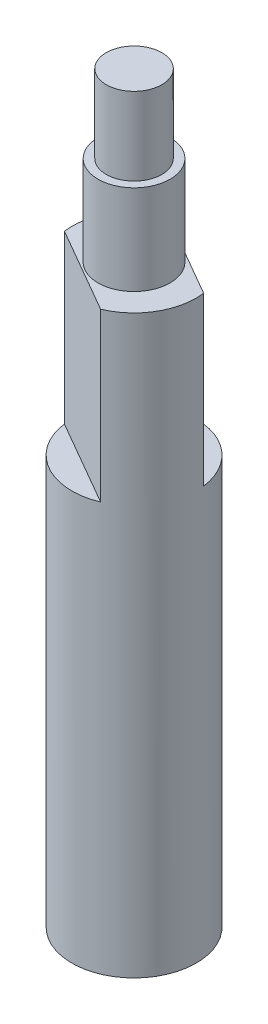
ISO-10303-21;
HEADER;
FILE_DESCRIPTION(('STEP AP214'),'2;1');
FILE_NAME('part.step','',(''),(''),'','','');
FILE_SCHEMA(('AUTOMOTIVE_DESIGN { 1 0 10303 214 1 1 1 1 }'));
ENDSEC;
DATA;
#1=APPLICATION_CONTEXT('core data for automotive mechanical design processes');
#2=APPLICATION_PROTOCOL_DEFINITION('international standard','automotive_design',2000,#1);
#3=PRODUCT_CONTEXT('',#1,'mechanical');
#4=PRODUCT('Part','Part','',(#3));
#5=PRODUCT_RELATED_PRODUCT_CATEGORY('part','',(#4));
#6=PRODUCT_DEFINITION_FORMATION('','',#4);
#7=PRODUCT_DEFINITION_CONTEXT('part definition',#1,'design');
#8=PRODUCT_DEFINITION('design','',#6,#7);
#9=PRODUCT_DEFINITION_SHAPE('','',#8);
#10=(LENGTH_UNIT() NAMED_UNIT(*) SI_UNIT(.MILLI.,.METRE.));
#11=(NAMED_UNIT(*) PLANE_ANGLE_UNIT() SI_UNIT($,.RADIAN.));
#12=(NAMED_UNIT(*) SI_UNIT($,.STERADIAN.) SOLID_ANGLE_UNIT());
#13=UNCERTAINTY_MEASURE_WITH_UNIT(LENGTH_MEASURE(1.E-05),#10,'distance_accuracy_value','');
#14=(GEOMETRIC_REPRESENTATION_CONTEXT(3) GLOBAL_UNCERTAINTY_ASSIGNED_CONTEXT((#13)) GLOBAL_UNIT_ASSIGNED_CONTEXT((#10,
#11,#12)) REPRESENTATION_CONTEXT('',''));
#15=CARTESIAN_POINT('',(0.,0.,0.));
#16=DIRECTION('',(0.,0.,1.));
#17=DIRECTION('',(1.,0.,0.));
#18=AXIS2_PLACEMENT_3D('',#15,#16,#17);
#19=CARTESIAN_POINT('',(625.914623134768,156.070044002464,0.));
#20=DIRECTION('',(0.,1.,0.));
#21=DIRECTION('',(0.,0.,1.));
#22=AXIS2_PLACEMENT_3D('',#19,#20,#21);
#23=PLANE('',#22);
#24=CARTESIAN_POINT('',(625.914623134768,156.070044002464,0.));
#25=DIRECTION('',(0.,1.,0.));
#26=DIRECTION('',(0.,0.,1.));
#27=AXIS2_PLACEMENT_3D('',#24,#25,#26);
#28=CIRCLE('',#27,3.175);
#29=CARTESIAN_POINT('',(625.914623134768,156.070044002464,3.17500000000001));
#30=VERTEX_POINT('',#29);
#31=EDGE_CURVE('E145',#30,#30,#28,.T.);
#32=ORIENTED_EDGE('',*,*,#31,.T.);
#33=EDGE_LOOP('',(#32));
#34=FACE_BOUND('',#33,.T.);
#35=CARTESIAN_POINT('',(625.914623134768,156.070044002464,0.));
#36=DIRECTION('',(0.,1.,0.));
#37=DIRECTION('',(0.,0.,1.));
#38=AXIS2_PLACEMENT_3D('',#35,#36,#37);
#39=CIRCLE('',#38,2.4511);
#40=CARTESIAN_POINT('',(625.914623134768,156.070044002464,-2.4511));
#41=VERTEX_POINT('',#40);
#42=EDGE_CURVE('E152',#41,#41,#39,.T.);
#43=ORIENTED_EDGE('',*,*,#42,.F.);
#44=EDGE_LOOP('',(#43));
#45=FACE_BOUND('',#44,.T.);
#46=ADVANCED_FACE('F32',(#34,#45),#23,.T.);
#47=CARTESIAN_POINT('',(631.401023134768,148.145244002464,0.));
#48=DIRECTION('',(0.,1.,0.));
#49=DIRECTION('',(0.,0.,1.));
#50=AXIS2_PLACEMENT_3D('',#47,#48,#49);
#51=PLANE('',#50);
#52=DIRECTION('',(0.866025403784436,0.,0.500000000000005));
#53=VECTOR('',#52,1.);
#54=CARTESIAN_POINT('',(623.800526733425,148.145244002464,-5.06272469781131));
#55=LINE('',#54,#53);
#56=CARTESIAN_POINT('',(623.800526733425,148.145244002464,-5.06272469781133));
#57=VERTEX_POINT('',#56);
#58=CARTESIAN_POINT('',(631.356119536111,148.145244002464,-0.700501159293341));
#59=VERTEX_POINT('',#58);
#60=EDGE_CURVE('E78',#57,#59,#55,.T.);
#61=ORIENTED_EDGE('',*,*,#60,.F.);
#62=CARTESIAN_POINT('',(625.914623134768,148.145244002464,0.));
#63=DIRECTION('',(0.,-1.,0.));
#64=DIRECTION('',(0.,0.,-1.));
#65=AXIS2_PLACEMENT_3D('',#62,#63,#64);
#66=CIRCLE('',#65,5.4864);
#67=CARTESIAN_POINT('',(620.473126733425,148.145244002464,0.700501159293356));
#68=VERTEX_POINT('',#67);
#69=EDGE_CURVE('E11',#68,#57,#66,.T.);
#70=ORIENTED_EDGE('',*,*,#69,.F.);
#71=DIRECTION('',(-0.866025403784436,0.,-0.500000000000005));
#72=VECTOR('',#71,1.);
#73=CARTESIAN_POINT('',(628.028719536111,148.145244002464,5.06272469781132));
#74=LINE('',#73,#72);
#75=CARTESIAN_POINT('',(628.028719536111,148.145244002464,5.06272469781133));
#76=VERTEX_POINT('',#75);
#77=EDGE_CURVE('E87',#76,#68,#74,.T.);
#78=ORIENTED_EDGE('',*,*,#77,.F.);
#79=EDGE_CURVE('E40',#59,#76,#66,.T.);
#80=ORIENTED_EDGE('',*,*,#79,.F.);
#81=EDGE_LOOP('',(#61,#70,#78,#80));
#82=FACE_BOUND('',#81,.T.);
#83=CARTESIAN_POINT('',(625.914623134768,148.145244002464,0.));
#84=DIRECTION('',(0.,1.,0.));
#85=DIRECTION('',(0.,0.,1.));
#86=AXIS2_PLACEMENT_3D('',#83,#84,#85);
#87=CIRCLE('',#86,3.175);
#88=CARTESIAN_POINT('',(625.914623134768,148.145244002464,3.17500000000001));
#89=VERTEX_POINT('',#88);
#90=EDGE_CURVE('E146',#89,#89,#87,.T.);
#91=ORIENTED_EDGE('',*,*,#90,.F.);
#92=EDGE_LOOP('',(#91));
#93=FACE_BOUND('',#92,.T.);
#94=ADVANCED_FACE('F106',(#82,#93),#51,.T.);
#95=CARTESIAN_POINT('',(625.914623134768,148.145244002464,0.));
#96=DIRECTION('',(0.,-1.,0.));
#97=DIRECTION('',(0.,0.,-1.));
#98=AXIS2_PLACEMENT_3D('',#95,#96,#97);
#99=CYLINDRICAL_SURFACE('',#98,5.4864);
#100=DIRECTION('',(0.,1.,0.));
#101=VECTOR('',#100,1.);
#102=CARTESIAN_POINT('',(623.800526733425,133.413244002464,-5.06272469781131));
#103=LINE('',#102,#101);
#104=CARTESIAN_POINT('',(623.800526733425,133.413244002464,-5.06272469781131));
#105=VERTEX_POINT('',#104);
#106=EDGE_CURVE('E47',#105,#57,#103,.T.);
#107=ORIENTED_EDGE('',*,*,#106,.F.);
#108=CARTESIAN_POINT('',(625.914623134768,133.413244002464,0.));
#109=DIRECTION('',(0.,1.,0.));
#110=DIRECTION('',(0.,0.,1.));
#111=AXIS2_PLACEMENT_3D('',#108,#109,#110);
#112=CIRCLE('',#111,5.48639999999998);
#113=CARTESIAN_POINT('',(631.356119536111,133.413244002464,-0.70050115929334));
#114=VERTEX_POINT('',#113);
#115=EDGE_CURVE('E75',#114,#105,#112,.T.);
#116=ORIENTED_EDGE('',*,*,#115,.F.);
#117=DIRECTION('',(0.,1.,0.));
#118=VECTOR('',#117,1.);
#119=CARTESIAN_POINT('',(631.356119536111,133.413244002464,-0.70050115929334));
#120=LINE('',#119,#118);
#121=EDGE_CURVE('E81',#114,#59,#120,.T.);
#122=ORIENTED_EDGE('',*,*,#121,.T.);
#123=ORIENTED_EDGE('',*,*,#79,.T.);
#124=DIRECTION('',(0.,1.,0.));
#125=VECTOR('',#124,1.);
#126=CARTESIAN_POINT('',(628.028719536111,133.413244002464,5.06272469781132));
#127=LINE('',#126,#125);
#128=CARTESIAN_POINT('',(628.028719536111,133.413244002464,5.06272469781132));
#129=VERTEX_POINT('',#128);
#130=EDGE_CURVE('E96',#129,#76,#127,.T.);
#131=ORIENTED_EDGE('',*,*,#130,.F.);
#132=CARTESIAN_POINT('',(625.914623134768,133.413244002464,0.));
#133=DIRECTION('',(0.,1.,0.));
#134=DIRECTION('',(0.,0.,1.));
#135=AXIS2_PLACEMENT_3D('',#132,#133,#134);
#136=CIRCLE('',#135,5.48639999999998);
#137=CARTESIAN_POINT('',(620.473126733425,133.413244002464,0.700501159293357));
#138=VERTEX_POINT('',#137);
#139=EDGE_CURVE('E91',#138,#129,#136,.T.);
#140=ORIENTED_EDGE('',*,*,#139,.F.);
#141=DIRECTION('',(0.,1.,0.));
#142=VECTOR('',#141,1.);
#143=CARTESIAN_POINT('',(620.473126733425,133.413244002464,0.700501159293357));
#144=LINE('',#143,#142);
#145=EDGE_CURVE('E98',#138,#68,#144,.T.);
#146=ORIENTED_EDGE('',*,*,#145,.T.);
#147=ORIENTED_EDGE('',*,*,#69,.T.);
#148=EDGE_LOOP('',(#107,#116,#122,#123,#131,#140,#146,#147));
#149=FACE_BOUND('',#148,.T.);
#150=CARTESIAN_POINT('',(625.914623134768,97.3452440024636,0.));
#151=DIRECTION('',(0.,-1.,0.));
#152=DIRECTION('',(0.,0.,-1.));
#153=AXIS2_PLACEMENT_3D('',#150,#151,#152);
#154=CIRCLE('',#153,5.4864);
#155=CARTESIAN_POINT('',(625.914623134768,97.3452440024636,-5.4864));
#156=VERTEX_POINT('',#155);
#157=EDGE_CURVE('E100',#156,#156,#154,.T.);
#158=ORIENTED_EDGE('',*,*,#157,.F.);
#159=EDGE_LOOP('',(#158));
#160=FACE_BOUND('',#159,.T.);
#161=ADVANCED_FACE('F34',(#149,#160),#99,.T.);
#162=CARTESIAN_POINT('',(625.914623134768,97.3452440024636,0.));
#163=DIRECTION('',(0.,-1.,0.));
#164=DIRECTION('',(0.,0.,-1.));
#165=AXIS2_PLACEMENT_3D('',#162,#163,#164);
#166=PLANE('',#165);
#167=ORIENTED_EDGE('',*,*,#157,.T.);
#168=EDGE_LOOP('',(#167));
#169=FACE_BOUND('',#168,.T.);
#170=ADVANCED_FACE('F104',(#169),#166,.T.);
#171=CARTESIAN_POINT('',(628.028719536111,133.413244002464,5.06272469781132));
#172=DIRECTION('',(0.500000000000005,0.,-0.866025403784436));
#173=DIRECTION('',(-0.866025403784436,0.,-0.500000000000005));
#174=AXIS2_PLACEMENT_3D('',#171,#172,#173);
#175=PLANE('',#174);
#176=ORIENTED_EDGE('',*,*,#77,.T.);
#177=ORIENTED_EDGE('',*,*,#145,.F.);
#178=DIRECTION('',(-0.866025403784436,0.,-0.500000000000005));
#179=VECTOR('',#178,1.);
#180=CARTESIAN_POINT('',(628.028719536111,133.413244002464,5.06272469781132));
#181=LINE('',#180,#179);
#182=EDGE_CURVE('E93',#129,#138,#181,.T.);
#183=ORIENTED_EDGE('',*,*,#182,.F.);
#184=ORIENTED_EDGE('',*,*,#130,.T.);
#185=EDGE_LOOP('',(#176,#177,#183,#184));
#186=FACE_BOUND('',#185,.T.);
#187=ADVANCED_FACE('F111',(#186),#175,.F.);
#188=CARTESIAN_POINT('',(625.914623134768,133.413244002464,0.));
#189=DIRECTION('',(0.,1.,0.));
#190=DIRECTION('',(0.,0.,1.));
#191=AXIS2_PLACEMENT_3D('',#188,#189,#190);
#192=PLANE('',#191);
#193=ORIENTED_EDGE('',*,*,#139,.T.);
#194=ORIENTED_EDGE('',*,*,#182,.T.);
#195=EDGE_LOOP('',(#193,#194));
#196=FACE_BOUND('',#195,.T.);
#197=ADVANCED_FACE('F133',(#196),#192,.T.);
#198=CARTESIAN_POINT('',(623.800526733425,133.413244002464,-5.06272469781131));
#199=DIRECTION('',(-0.500000000000005,0.,0.866025403784436));
#200=DIRECTION('',(0.866025403784436,0.,0.500000000000005));
#201=AXIS2_PLACEMENT_3D('',#198,#199,#200);
#202=PLANE('',#201);
#203=ORIENTED_EDGE('',*,*,#60,.T.);
#204=ORIENTED_EDGE('',*,*,#121,.F.);
#205=DIRECTION('',(0.866025403784436,0.,0.500000000000005));
#206=VECTOR('',#205,1.);
#207=CARTESIAN_POINT('',(623.800526733425,133.413244002464,-5.06272469781131));
#208=LINE('',#207,#206);
#209=EDGE_CURVE('E77',#105,#114,#208,.T.);
#210=ORIENTED_EDGE('',*,*,#209,.F.);
#211=ORIENTED_EDGE('',*,*,#106,.T.);
#212=EDGE_LOOP('',(#203,#204,#210,#211));
#213=FACE_BOUND('',#212,.T.);
#214=ADVANCED_FACE('F80',(#213),#202,.F.);
#215=CARTESIAN_POINT('',(625.914623134768,133.413244002464,0.));
#216=DIRECTION('',(0.,1.,0.));
#217=DIRECTION('',(0.,0.,1.));
#218=AXIS2_PLACEMENT_3D('',#215,#216,#217);
#219=PLANE('',#218);
#220=ORIENTED_EDGE('',*,*,#115,.T.);
#221=ORIENTED_EDGE('',*,*,#209,.T.);
#222=EDGE_LOOP('',(#220,#221));
#223=FACE_BOUND('',#222,.T.);
#224=ADVANCED_FACE('F76',(#223),#219,.T.);
#225=CARTESIAN_POINT('',(625.914623134768,156.070044002464,0.));
#226=DIRECTION('',(0.,-1.,0.));
#227=DIRECTION('',(0.,0.,-1.));
#228=AXIS2_PLACEMENT_3D('',#225,#226,#227);
#229=CYLINDRICAL_SURFACE('',#228,3.175);
#230=ORIENTED_EDGE('',*,*,#31,.F.);
#231=EDGE_LOOP('',(#230));
#232=FACE_BOUND('',#231,.T.);
#233=ORIENTED_EDGE('',*,*,#90,.T.);
#234=EDGE_LOOP('',(#233));
#235=FACE_BOUND('',#234,.T.);
#236=ADVANCED_FACE('F125',(#232,#235),#229,.T.);
#237=CARTESIAN_POINT('',(625.914623134768,162.928044002464,0.));
#238=DIRECTION('',(0.,-1.,0.));
#239=DIRECTION('',(0.,0.,-1.));
#240=AXIS2_PLACEMENT_3D('',#237,#238,#239);
#241=CYLINDRICAL_SURFACE('',#240,2.4511);
#242=CARTESIAN_POINT('',(625.914623134768,162.928044002464,0.));
#243=DIRECTION('',(0.,1.,0.));
#244=DIRECTION('',(0.,0.,1.));
#245=AXIS2_PLACEMENT_3D('',#242,#243,#244);
#246=CIRCLE('',#245,2.4511);
#247=CARTESIAN_POINT('',(625.914623134768,162.928044002464,-2.4511));
#248=VERTEX_POINT('',#247);
#249=EDGE_CURVE('E150',#248,#248,#246,.T.);
#250=CARTESIAN_POINT('',(625.914623134768,162.928044002464,-2.4511));
#251=CARTESIAN_POINT('',(625.914623134768,162.856606502464,-2.4511));
#252=CARTESIAN_POINT('',(625.914623134768,162.785169002464,-2.4511));
#253=CARTESIAN_POINT('',(625.914623134768,162.642294002464,-2.4511));
#254=CARTESIAN_POINT('',(625.914623134768,162.570856502463,-2.4511));
#255=CARTESIAN_POINT('',(625.914623134768,162.427981502464,-2.4511));
#256=CARTESIAN_POINT('',(625.914623134768,162.356544002463,-2.4511));
#257=CARTESIAN_POINT('',(625.914623134768,162.213669002464,-2.4511));
#258=CARTESIAN_POINT('',(625.914623134768,162.142231502464,-2.4511));
#259=CARTESIAN_POINT('',(625.914623134768,161.999356502464,-2.4511));
#260=CARTESIAN_POINT('',(625.914623134768,161.927919002464,-2.4511));
#261=CARTESIAN_POINT('',(625.914623134768,161.785044002464,-2.4511));
#262=CARTESIAN_POINT('',(625.914623134768,161.713606502464,-2.4511));
#263=CARTESIAN_POINT('',(625.914623134768,161.570731502464,-2.4511));
#264=CARTESIAN_POINT('',(625.914623134768,161.499294002464,-2.4511));
#265=CARTESIAN_POINT('',(625.914623134768,161.356419002464,-2.4511));
#266=CARTESIAN_POINT('',(625.914623134768,161.284981502463,-2.4511));
#267=CARTESIAN_POINT('',(625.914623134768,161.142106502464,-2.4511));
#268=CARTESIAN_POINT('',(625.914623134768,161.070669002463,-2.4511));
#269=CARTESIAN_POINT('',(625.914623134768,160.927794002464,-2.4511));
#270=CARTESIAN_POINT('',(625.914623134768,160.856356502464,-2.4511));
#271=CARTESIAN_POINT('',(625.914623134768,160.713481502464,-2.4511));
#272=CARTESIAN_POINT('',(625.914623134768,160.642044002464,-2.4511));
#273=CARTESIAN_POINT('',(625.914623134768,160.499169002464,-2.4511));
#274=CARTESIAN_POINT('',(625.914623134768,160.427731502464,-2.4511));
#275=CARTESIAN_POINT('',(625.914623134768,160.284856502464,-2.4511));
#276=CARTESIAN_POINT('',(625.914623134768,160.213419002464,-2.4511));
#277=CARTESIAN_POINT('',(625.914623134768,160.070544002464,-2.4511));
#278=CARTESIAN_POINT('',(625.914623134768,159.999106502464,-2.4511));
#279=CARTESIAN_POINT('',(625.914623134768,159.856231502464,-2.4511));
#280=CARTESIAN_POINT('',(625.914623134768,159.784794002464,-2.4511));
#281=CARTESIAN_POINT('',(625.914623134768,159.641919002464,-2.4511));
#282=CARTESIAN_POINT('',(625.914623134768,159.570481502464,-2.4511));
#283=CARTESIAN_POINT('',(625.914623134768,159.427606502464,-2.4511));
#284=CARTESIAN_POINT('',(625.914623134768,159.356169002464,-2.4511));
#285=CARTESIAN_POINT('',(625.914623134768,159.213294002464,-2.4511));
#286=CARTESIAN_POINT('',(625.914623134768,159.141856502464,-2.4511));
#287=CARTESIAN_POINT('',(625.914623134768,158.998981502464,-2.4511));
#288=CARTESIAN_POINT('',(625.914623134768,158.927544002463,-2.4511));
#289=CARTESIAN_POINT('',(625.914623134768,158.784669002464,-2.4511));
#290=CARTESIAN_POINT('',(625.914623134768,158.713231502464,-2.4511));
#291=CARTESIAN_POINT('',(625.914623134768,158.570356502464,-2.4511));
#292=CARTESIAN_POINT('',(625.914623134768,158.498919002464,-2.4511));
#293=CARTESIAN_POINT('',(625.914623134768,158.356044002464,-2.4511));
#294=CARTESIAN_POINT('',(625.914623134768,158.284606502464,-2.4511));
#295=CARTESIAN_POINT('',(625.914623134768,158.141731502464,-2.4511));
#296=CARTESIAN_POINT('',(625.914623134768,158.070294002464,-2.4511));
#297=CARTESIAN_POINT('',(625.914623134768,157.927419002464,-2.4511));
#298=CARTESIAN_POINT('',(625.914623134768,157.855981502464,-2.4511));
#299=CARTESIAN_POINT('',(625.914623134768,157.713106502464,-2.4511));
#300=CARTESIAN_POINT('',(625.914623134768,157.641669002464,-2.4511));
#301=CARTESIAN_POINT('',(625.914623134768,157.498794002464,-2.4511));
#302=CARTESIAN_POINT('',(625.914623134768,157.427356502464,-2.4511));
#303=CARTESIAN_POINT('',(625.914623134768,157.284481502464,-2.4511));
#304=CARTESIAN_POINT('',(625.914623134768,157.213044002464,-2.4511));
#305=CARTESIAN_POINT('',(625.914623134768,157.070169002464,-2.4511));
#306=CARTESIAN_POINT('',(625.914623134768,156.998731502464,-2.4511));
#307=CARTESIAN_POINT('',(625.914623134768,156.855856502464,-2.4511));
#308=CARTESIAN_POINT('',(625.914623134768,156.784419002464,-2.4511));
#309=CARTESIAN_POINT('',(625.914623134768,156.641544002464,-2.4511));
#310=CARTESIAN_POINT('',(625.914623134768,156.570106502464,-2.4511));
#311=CARTESIAN_POINT('',(625.914623134768,156.427231502464,-2.4511));
#312=CARTESIAN_POINT('',(625.914623134768,156.355794002464,-2.4511));
#313=CARTESIAN_POINT('',(625.914623134768,156.212919002464,-2.4511));
#314=CARTESIAN_POINT('',(625.914623134768,156.141481502464,-2.4511));
#315=CARTESIAN_POINT('',(625.914623134768,156.070044002464,-2.4511));
#316=B_SPLINE_CURVE_WITH_KNOTS('',3,(#250,#251,#252,#253,#254,#255,#256,#257,#258,#259,#260,
#261,#262,#263,#264,#265,#266,#267,#268,#269,#270,#271,#272,#273,#274,#275,#276,#277,#278,#279,
#280,#281,#282,#283,#284,#285,#286,#287,#288,#289,#290,#291,#292,#293,#294,#295,#296,#297,#298,
#299,#300,#301,#302,#303,#304,#305,#306,#307,#308,#309,#310,#311,#312,#313,#314,#315),
.UNSPECIFIED.,.F.,.F.,(4,2,2,2,2,2,2,2,2,2,2,2,2,2,2,2,2,2,2,2,2,2,2,2,2,2,2,2,2,2,2,2,4),(0.,
0.21431249999998,0.428624999999988,0.642937499999996,0.857249999999976,1.07156249999998,
1.28587499999999,1.50018749999997,1.71449999999998,1.92881249999999,2.14312499999997,
2.35743749999998,2.57174999999998,2.78606249999996,3.00037499999997,3.21468749999998,
3.42899999999999,3.64331249999997,3.85762499999998,4.07193749999998,4.28624999999996,
4.50056249999997,4.71487499999998,4.92918749999996,5.14349999999997,5.35781249999998,
5.57212499999996,5.78643749999996,6.00074999999997,6.21506249999995,6.42937499999996,
6.64368749999997,6.85799999999998),.UNSPECIFIED.);
#317=EDGE_CURVE('BSEAM123',#248,#41,#316,.T.);
#318=ORIENTED_EDGE('',*,*,#249,.F.);
#319=ORIENTED_EDGE('',*,*,#42,.T.);
#320=ORIENTED_EDGE('',*,*,#317,.T.);
#321=ORIENTED_EDGE('',*,*,#317,.F.);
#322=EDGE_LOOP('',(#318,#320,#319,#321));
#323=FACE_BOUND('',#322,.T.);
#324=ADVANCED_FACE('F123',(#323),#241,.T.);
#325=CARTESIAN_POINT('',(625.914623134768,162.928044002464,0.));
#326=DIRECTION('',(0.,1.,0.));
#327=DIRECTION('',(0.,0.,1.));
#328=AXIS2_PLACEMENT_3D('',#325,#326,#327);
#329=PLANE('',#328);
#330=ORIENTED_EDGE('',*,*,#249,.T.);
#331=EDGE_LOOP('',(#330));
#332=FACE_BOUND('',#331,.T.);
#333=ADVANCED_FACE('F158',(#332),#329,.T.);
#334=CLOSED_SHELL('',(#46,#94,#161,#170,#187,#197,#214,#224,#236,#324,#333));
#335=MANIFOLD_SOLID_BREP('B2',#334);
#336=ADVANCED_BREP_SHAPE_REPRESENTATION('',(#18,#335),#14);
#337=SHAPE_DEFINITION_REPRESENTATION(#9,#336);
ENDSEC;
END-ISO-10303-21;
